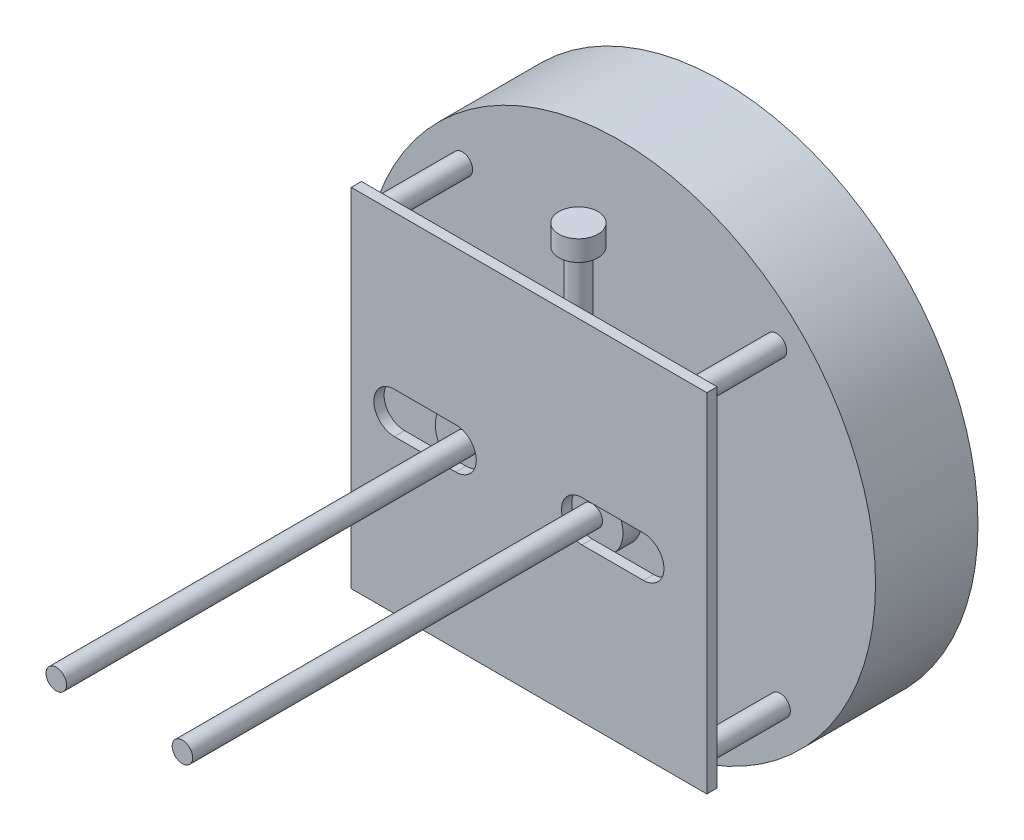
ISO-10303-21;
HEADER;
FILE_DESCRIPTION(('STEP AP214'),'2;1');
FILE_NAME('part.step','',(''),(''),'','','');
FILE_SCHEMA(('AUTOMOTIVE_DESIGN { 1 0 10303 214 1 1 1 1 }'));
ENDSEC;
DATA;
#1=APPLICATION_CONTEXT('core data for automotive mechanical design processes');
#2=APPLICATION_PROTOCOL_DEFINITION('international standard','automotive_design',2000,#1);
#3=PRODUCT_CONTEXT('',#1,'mechanical');
#4=PRODUCT('Part','Part','',(#3));
#5=PRODUCT_RELATED_PRODUCT_CATEGORY('part','',(#4));
#6=PRODUCT_DEFINITION_FORMATION('','',#4);
#7=PRODUCT_DEFINITION_CONTEXT('part definition',#1,'design');
#8=PRODUCT_DEFINITION('design','',#6,#7);
#9=PRODUCT_DEFINITION_SHAPE('','',#8);
#10=(LENGTH_UNIT() NAMED_UNIT(*) SI_UNIT(.MILLI.,.METRE.));
#11=(NAMED_UNIT(*) PLANE_ANGLE_UNIT() SI_UNIT($,.RADIAN.));
#12=(NAMED_UNIT(*) SI_UNIT($,.STERADIAN.) SOLID_ANGLE_UNIT());
#13=UNCERTAINTY_MEASURE_WITH_UNIT(LENGTH_MEASURE(1.E-05),#10,'distance_accuracy_value','');
#14=(GEOMETRIC_REPRESENTATION_CONTEXT(3) GLOBAL_UNCERTAINTY_ASSIGNED_CONTEXT((#13)) GLOBAL_UNIT_ASSIGNED_CONTEXT((#10,
#11,#12)) REPRESENTATION_CONTEXT('',''));
#15=CARTESIAN_POINT('',(0.,0.,0.));
#16=DIRECTION('',(0.,0.,1.));
#17=DIRECTION('',(1.,0.,0.));
#18=AXIS2_PLACEMENT_3D('',#15,#16,#17);
#19=CARTESIAN_POINT('',(0.,-30.,70.));
#20=DIRECTION('',(0.,-1.,0.));
#21=DIRECTION('',(1.,0.,0.));
#22=AXIS2_PLACEMENT_3D('',#19,#20,#21);
#23=CYLINDRICAL_SURFACE('',#22,5.);
#24=CARTESIAN_POINT('',(0.,-30.,70.));
#25=DIRECTION('',(0.,0.707106781186547,-0.707106781186547));
#26=DIRECTION('',(0.,-0.707106781186547,-0.707106781186547));
#27=AXIS2_PLACEMENT_3D('',#24,#25,#26);
#28=ELLIPSE('',#27,7.07106781186548,5.);
#29=CARTESIAN_POINT('',(5.,-30.,70.));
#30=VERTEX_POINT('',#29);
#31=CARTESIAN_POINT('',(-5.,-30.,70.));
#32=VERTEX_POINT('',#31);
#33=EDGE_CURVE('E193',#30,#32,#28,.T.);
#34=ORIENTED_EDGE('',*,*,#33,.F.);
#35=CARTESIAN_POINT('',(0.,-30.,70.));
#36=DIRECTION('',(0.,-1.,0.));
#37=DIRECTION('',(1.,0.,0.));
#38=AXIS2_PLACEMENT_3D('',#35,#36,#37);
#39=CIRCLE('',#38,5.);
#40=EDGE_CURVE('E69',#30,#32,#39,.T.);
#41=ORIENTED_EDGE('',*,*,#40,.T.);
#42=EDGE_LOOP('',(#34,#41));
#43=FACE_BOUND('',#42,.T.);
#44=CARTESIAN_POINT('',(0.,-90.,70.));
#45=DIRECTION('',(0.,-1.,0.));
#46=DIRECTION('',(1.,0.,0.));
#47=AXIS2_PLACEMENT_3D('',#44,#45,#46);
#48=CIRCLE('',#47,5.);
#49=CARTESIAN_POINT('',(5.00000000000001,-90.,70.));
#50=VERTEX_POINT('',#49);
#51=EDGE_CURVE('E57',#50,#50,#48,.F.);
#52=ORIENTED_EDGE('',*,*,#51,.T.);
#53=EDGE_LOOP('',(#52));
#54=FACE_BOUND('',#53,.T.);
#55=ADVANCED_FACE('F53',(#43,#54),#23,.T.);
#56=CARTESIAN_POINT('',(0.,30.,70.));
#57=DIRECTION('',(0.,1.,0.));
#58=DIRECTION('',(0.,0.,1.));
#59=AXIS2_PLACEMENT_3D('',#56,#57,#58);
#60=CYLINDRICAL_SURFACE('',#59,5.);
#61=CARTESIAN_POINT('',(0.,30.,70.));
#62=DIRECTION('',(0.,0.707106781186547,-0.707106781186547));
#63=DIRECTION('',(0.,-0.707106781186547,-0.707106781186547));
#64=AXIS2_PLACEMENT_3D('',#61,#62,#63);
#65=ELLIPSE('',#64,7.07106781186547,5.);
#66=CARTESIAN_POINT('',(5.,30.,70.));
#67=VERTEX_POINT('',#66);
#68=CARTESIAN_POINT('',(0.,25.,65.));
#69=VERTEX_POINT('',#68);
#70=EDGE_CURVE('E181',#67,#69,#65,.T.);
#71=ORIENTED_EDGE('',*,*,#70,.F.);
#72=CARTESIAN_POINT('',(0.,30.,70.));
#73=DIRECTION('',(0.,-0.707106781186547,-0.707106781186547));
#74=DIRECTION('',(0.,0.707106781186547,-0.707106781186547));
#75=AXIS2_PLACEMENT_3D('',#72,#73,#74);
#76=ELLIPSE('',#75,7.07106781186547,5.);
#77=CARTESIAN_POINT('',(-5.,30.,70.));
#78=VERTEX_POINT('',#77);
#79=EDGE_CURVE('E179',#78,#67,#76,.T.);
#80=ORIENTED_EDGE('',*,*,#79,.F.);
#81=EDGE_CURVE('E172',#69,#78,#65,.T.);
#82=ORIENTED_EDGE('',*,*,#81,.F.);
#83=CARTESIAN_POINT('',(0.,25.,70.));
#84=DIRECTION('',(0.,-1.,0.));
#85=DIRECTION('',(0.,0.,-1.));
#86=AXIS2_PLACEMENT_3D('',#83,#84,#85);
#87=CIRCLE('',#86,5.);
#88=EDGE_CURVE('E176',#69,#69,#87,.T.);
#89=ORIENTED_EDGE('',*,*,#88,.F.);
#90=EDGE_LOOP('',(#71,#80,#82,#89));
#91=FACE_BOUND('',#90,.T.);
#92=CARTESIAN_POINT('',(0.,90.,70.));
#93=DIRECTION('',(0.,1.,0.));
#94=DIRECTION('',(0.,0.,1.));
#95=AXIS2_PLACEMENT_3D('',#92,#93,#94);
#96=CIRCLE('',#95,5.);
#97=CARTESIAN_POINT('',(0.,90.,75.));
#98=VERTEX_POINT('',#97);
#99=EDGE_CURVE('E185',#98,#98,#96,.F.);
#100=ORIENTED_EDGE('',*,*,#99,.T.);
#101=EDGE_LOOP('',(#100));
#102=FACE_BOUND('',#101,.T.);
#103=ADVANCED_FACE('F174',(#91,#102),#60,.T.);
#104=CARTESIAN_POINT('',(0.,-30.,70.));
#105=DIRECTION('',(0.,0.,1.));
#106=DIRECTION('',(1.,0.,0.));
#107=AXIS2_PLACEMENT_3D('',#104,#105,#106);
#108=PLANE('',#107);
#109=CARTESIAN_POINT('',(0.,-30.,70.));
#110=DIRECTION('',(0.,0.,1.));
#111=DIRECTION('',(1.,0.,0.));
#112=AXIS2_PLACEMENT_3D('',#109,#110,#111);
#113=CIRCLE('',#112,5.);
#114=EDGE_CURVE('E198',#30,#32,#113,.T.);
#115=ORIENTED_EDGE('',*,*,#114,.T.);
#116=DIRECTION('',(1.,0.,0.));
#117=VECTOR('',#116,1.);
#118=CARTESIAN_POINT('',(0.,-30.,70.));
#119=LINE('',#118,#117);
#120=EDGE_CURVE('E12',#32,#30,#119,.T.);
#121=ORIENTED_EDGE('',*,*,#120,.T.);
#122=EDGE_LOOP('',(#115,#121));
#123=FACE_BOUND('',#122,.T.);
#124=ADVANCED_FACE('F408',(#123),#108,.T.);
#125=CARTESIAN_POINT('',(0.,0.,50.));
#126=DIRECTION('',(0.,0.,-1.));
#127=DIRECTION('',(-1.,0.,0.));
#128=AXIS2_PLACEMENT_3D('',#125,#126,#127);
#129=CYLINDRICAL_SURFACE('',#128,125.);
#130=CARTESIAN_POINT('',(0.,0.,50.));
#131=DIRECTION('',(0.,0.,1.));
#132=DIRECTION('',(1.,0.,0.));
#133=AXIS2_PLACEMENT_3D('',#130,#131,#132);
#134=CIRCLE('',#133,125.);
#135=CARTESIAN_POINT('',(125.,0.,50.));
#136=VERTEX_POINT('',#135);
#137=EDGE_CURVE('E322',#136,#136,#134,.T.);
#138=ORIENTED_EDGE('',*,*,#137,.F.);
#139=EDGE_LOOP('',(#138));
#140=FACE_BOUND('',#139,.T.);
#141=CARTESIAN_POINT('',(0.,0.,0.));
#142=DIRECTION('',(0.,0.,1.));
#143=DIRECTION('',(1.,0.,0.));
#144=AXIS2_PLACEMENT_3D('',#141,#142,#143);
#145=CIRCLE('',#144,125.);
#146=CARTESIAN_POINT('',(125.,0.,0.));
#147=VERTEX_POINT('',#146);
#148=EDGE_CURVE('E319',#147,#147,#145,.T.);
#149=ORIENTED_EDGE('',*,*,#148,.T.);
#150=EDGE_LOOP('',(#149));
#151=FACE_BOUND('',#150,.T.);
#152=ADVANCED_FACE('F55',(#140,#151),#129,.T.);
#153=CARTESIAN_POINT('',(0.,0.,50.));
#154=DIRECTION('',(0.,0.,1.));
#155=DIRECTION('',(1.,0.,0.));
#156=AXIS2_PLACEMENT_3D('',#153,#154,#155);
#157=PLANE('',#156);
#158=CARTESIAN_POINT('',(0.,-30.,50.));
#159=DIRECTION('',(0.,0.,1.));
#160=DIRECTION('',(1.,0.,0.));
#161=AXIS2_PLACEMENT_3D('',#158,#159,#160);
#162=CIRCLE('',#161,5.);
#163=CARTESIAN_POINT('',(5.,-30.,50.));
#164=VERTEX_POINT('',#163);
#165=EDGE_CURVE('E197',#164,#164,#162,.T.);
#166=ORIENTED_EDGE('',*,*,#165,.F.);
#167=EDGE_LOOP('',(#166));
#168=FACE_BOUND('',#167,.T.);
#169=CARTESIAN_POINT('',(0.,30.,50.));
#170=DIRECTION('',(0.,0.,1.));
#171=DIRECTION('',(1.,0.,0.));
#172=AXIS2_PLACEMENT_3D('',#169,#170,#171);
#173=CIRCLE('',#172,5.);
#174=CARTESIAN_POINT('',(5.,30.,50.));
#175=VERTEX_POINT('',#174);
#176=EDGE_CURVE('E201',#175,#175,#173,.T.);
#177=ORIENTED_EDGE('',*,*,#176,.F.);
#178=EDGE_LOOP('',(#177));
#179=FACE_BOUND('',#178,.T.);
#180=CARTESIAN_POINT('',(-76.6421356237309,-76.642135623731,50.));
#181=DIRECTION('',(0.,0.,1.));
#182=DIRECTION('',(1.,0.,0.));
#183=AXIS2_PLACEMENT_3D('',#180,#181,#182);
#184=CIRCLE('',#183,5.00000000000001);
#185=CARTESIAN_POINT('',(-71.6421356237309,-76.642135623731,50.));
#186=VERTEX_POINT('',#185);
#187=EDGE_CURVE('E297',#186,#186,#184,.T.);
#188=ORIENTED_EDGE('',*,*,#187,.F.);
#189=EDGE_LOOP('',(#188));
#190=FACE_BOUND('',#189,.T.);
#191=CARTESIAN_POINT('',(78.4136911559998,-74.6142244403616,50.));
#192=DIRECTION('',(0.,0.,1.));
#193=DIRECTION('',(1.,0.,0.));
#194=AXIS2_PLACEMENT_3D('',#191,#192,#193);
#195=CIRCLE('',#194,5.00000000000001);
#196=CARTESIAN_POINT('',(83.4136911559998,-74.6142244403616,50.));
#197=VERTEX_POINT('',#196);
#198=EDGE_CURVE('E301',#197,#197,#195,.T.);
#199=ORIENTED_EDGE('',*,*,#198,.F.);
#200=EDGE_LOOP('',(#199));
#201=FACE_BOUND('',#200,.T.);
#202=CARTESIAN_POINT('',(76.642135623731,76.642135623731,50.));
#203=DIRECTION('',(0.,0.,1.));
#204=DIRECTION('',(1.,0.,0.));
#205=AXIS2_PLACEMENT_3D('',#202,#203,#204);
#206=CIRCLE('',#205,5.00000000000001);
#207=CARTESIAN_POINT('',(81.642135623731,76.642135623731,50.));
#208=VERTEX_POINT('',#207);
#209=EDGE_CURVE('E307',#208,#208,#206,.T.);
#210=ORIENTED_EDGE('',*,*,#209,.F.);
#211=EDGE_LOOP('',(#210));
#212=FACE_BOUND('',#211,.T.);
#213=CARTESIAN_POINT('',(-76.642135623731,76.6421356237309,50.));
#214=DIRECTION('',(0.,0.,1.));
#215=DIRECTION('',(1.,0.,0.));
#216=AXIS2_PLACEMENT_3D('',#213,#214,#215);
#217=CIRCLE('',#216,5.00000000000001);
#218=CARTESIAN_POINT('',(-71.642135623731,76.6421356237309,50.));
#219=VERTEX_POINT('',#218);
#220=EDGE_CURVE('E313',#219,#219,#217,.T.);
#221=ORIENTED_EDGE('',*,*,#220,.F.);
#222=EDGE_LOOP('',(#221));
#223=FACE_BOUND('',#222,.T.);
#224=ORIENTED_EDGE('',*,*,#137,.T.);
#225=EDGE_LOOP('',(#224));
#226=FACE_BOUND('',#225,.T.);
#227=ADVANCED_FACE('F639',(#168,#179,#190,#201,#212,#223,#226),#157,.T.);
#228=CARTESIAN_POINT('',(0.,0.,0.));
#229=DIRECTION('',(0.,0.,1.));
#230=DIRECTION('',(1.,0.,0.));
#231=AXIS2_PLACEMENT_3D('',#228,#229,#230);
#232=PLANE('',#231);
#233=ORIENTED_EDGE('',*,*,#148,.F.);
#234=EDGE_LOOP('',(#233));
#235=FACE_BOUND('',#234,.T.);
#236=ADVANCED_FACE('F646',(#235),#232,.F.);
#237=CARTESIAN_POINT('',(-76.642135623731,76.6421356237309,90.));
#238=DIRECTION('',(0.,0.,-1.));
#239=DIRECTION('',(-1.,0.,0.));
#240=AXIS2_PLACEMENT_3D('',#237,#238,#239);
#241=CYLINDRICAL_SURFACE('',#240,5.00000000000001);
#242=CARTESIAN_POINT('',(-76.642135623731,76.6421356237309,90.));
#243=DIRECTION('',(0.,0.,1.));
#244=DIRECTION('',(1.,0.,0.));
#245=AXIS2_PLACEMENT_3D('',#242,#243,#244);
#246=CIRCLE('',#245,5.00000000000001);
#247=CARTESIAN_POINT('',(-71.642135623731,76.6421356237309,90.));
#248=VERTEX_POINT('',#247);
#249=EDGE_CURVE('E316',#248,#248,#246,.T.);
#250=ORIENTED_EDGE('',*,*,#249,.F.);
#251=EDGE_LOOP('',(#250));
#252=FACE_BOUND('',#251,.T.);
#253=ORIENTED_EDGE('',*,*,#220,.T.);
#254=EDGE_LOOP('',(#253));
#255=FACE_BOUND('',#254,.T.);
#256=ADVANCED_FACE('F653',(#252,#255),#241,.T.);
#257=CARTESIAN_POINT('',(76.642135623731,76.642135623731,90.));
#258=DIRECTION('',(0.,0.,-1.));
#259=DIRECTION('',(-1.,0.,0.));
#260=AXIS2_PLACEMENT_3D('',#257,#258,#259);
#261=CYLINDRICAL_SURFACE('',#260,5.00000000000001);
#262=CARTESIAN_POINT('',(76.642135623731,76.642135623731,90.));
#263=DIRECTION('',(0.,0.,1.));
#264=DIRECTION('',(1.,0.,0.));
#265=AXIS2_PLACEMENT_3D('',#262,#263,#264);
#266=CIRCLE('',#265,5.00000000000001);
#267=CARTESIAN_POINT('',(81.642135623731,76.642135623731,90.));
#268=VERTEX_POINT('',#267);
#269=EDGE_CURVE('E310',#268,#268,#266,.T.);
#270=ORIENTED_EDGE('',*,*,#269,.F.);
#271=EDGE_LOOP('',(#270));
#272=FACE_BOUND('',#271,.T.);
#273=ORIENTED_EDGE('',*,*,#209,.T.);
#274=EDGE_LOOP('',(#273));
#275=FACE_BOUND('',#274,.T.);
#276=ADVANCED_FACE('F660',(#272,#275),#261,.T.);
#277=CARTESIAN_POINT('',(78.4136911559998,-74.6142244403616,90.));
#278=DIRECTION('',(0.,0.,-1.));
#279=DIRECTION('',(-1.,0.,0.));
#280=AXIS2_PLACEMENT_3D('',#277,#278,#279);
#281=CYLINDRICAL_SURFACE('',#280,5.00000000000001);
#282=CARTESIAN_POINT('',(78.4136911559998,-74.6142244403616,90.));
#283=DIRECTION('',(0.,0.,1.));
#284=DIRECTION('',(1.,0.,0.));
#285=AXIS2_PLACEMENT_3D('',#282,#283,#284);
#286=CIRCLE('',#285,5.00000000000001);
#287=CARTESIAN_POINT('',(83.4136911559998,-74.6142244403616,90.));
#288=VERTEX_POINT('',#287);
#289=EDGE_CURVE('E304',#288,#288,#286,.T.);
#290=ORIENTED_EDGE('',*,*,#289,.F.);
#291=EDGE_LOOP('',(#290));
#292=FACE_BOUND('',#291,.T.);
#293=ORIENTED_EDGE('',*,*,#198,.T.);
#294=EDGE_LOOP('',(#293));
#295=FACE_BOUND('',#294,.T.);
#296=ADVANCED_FACE('F668',(#292,#295),#281,.T.);
#297=CARTESIAN_POINT('',(-76.6421356237309,-76.642135623731,90.));
#298=DIRECTION('',(0.,0.,-1.));
#299=DIRECTION('',(-1.,0.,0.));
#300=AXIS2_PLACEMENT_3D('',#297,#298,#299);
#301=CYLINDRICAL_SURFACE('',#300,5.00000000000001);
#302=CARTESIAN_POINT('',(-76.6421356237309,-76.642135623731,90.));
#303=DIRECTION('',(0.,0.,1.));
#304=DIRECTION('',(1.,0.,0.));
#305=AXIS2_PLACEMENT_3D('',#302,#303,#304);
#306=CIRCLE('',#305,5.00000000000001);
#307=CARTESIAN_POINT('',(-71.6421356237309,-76.642135623731,90.));
#308=VERTEX_POINT('',#307);
#309=EDGE_CURVE('E298',#308,#308,#306,.T.);
#310=ORIENTED_EDGE('',*,*,#309,.F.);
#311=EDGE_LOOP('',(#310));
#312=FACE_BOUND('',#311,.T.);
#313=ORIENTED_EDGE('',*,*,#187,.T.);
#314=EDGE_LOOP('',(#313));
#315=FACE_BOUND('',#314,.T.);
#316=ADVANCED_FACE('F676',(#312,#315),#301,.T.);
#317=CARTESIAN_POINT('',(-85.8829322655471,84.5606318369034,95.));
#318=DIRECTION('',(1.,0.,0.));
#319=DIRECTION('',(0.,0.,-1.));
#320=AXIS2_PLACEMENT_3D('',#317,#318,#319);
#321=PLANE('',#320);
#322=DIRECTION('',(0.,-1.,0.));
#323=VECTOR('',#322,1.);
#324=CARTESIAN_POINT('',(-85.8829322655471,84.5606318369034,90.));
#325=LINE('',#324,#323);
#326=CARTESIAN_POINT('',(-85.8829322655471,84.5606318369034,90.));
#327=VERTEX_POINT('',#326);
#328=CARTESIAN_POINT('',(-85.8829322655471,-85.0670684054218,90.));
#329=VERTEX_POINT('',#328);
#330=EDGE_CURVE('E261',#327,#329,#325,.T.);
#331=ORIENTED_EDGE('',*,*,#330,.T.);
#332=DIRECTION('',(0.,0.,-1.));
#333=VECTOR('',#332,1.);
#334=CARTESIAN_POINT('',(-85.8829322655471,-85.0670684054218,95.));
#335=LINE('',#334,#333);
#336=CARTESIAN_POINT('',(-85.8829322655471,-85.0670684054218,95.));
#337=VERTEX_POINT('',#336);
#338=EDGE_CURVE('E294',#337,#329,#335,.T.);
#339=ORIENTED_EDGE('',*,*,#338,.F.);
#340=DIRECTION('',(0.,-1.,0.));
#341=VECTOR('',#340,1.);
#342=CARTESIAN_POINT('',(-85.8829322655471,84.5606318369034,95.));
#343=LINE('',#342,#341);
#344=CARTESIAN_POINT('',(-85.8829322655471,84.5606318369034,95.));
#345=VERTEX_POINT('',#344);
#346=EDGE_CURVE('E268',#345,#337,#343,.T.);
#347=ORIENTED_EDGE('',*,*,#346,.F.);
#348=DIRECTION('',(0.,0.,-1.));
#349=VECTOR('',#348,1.);
#350=CARTESIAN_POINT('',(-85.8829322655471,84.5606318369034,95.));
#351=LINE('',#350,#349);
#352=EDGE_CURVE('E278',#345,#327,#351,.T.);
#353=ORIENTED_EDGE('',*,*,#352,.T.);
#354=EDGE_LOOP('',(#331,#339,#347,#353));
#355=FACE_BOUND('',#354,.T.);
#356=ADVANCED_FACE('F684',(#355),#321,.F.);
#357=CARTESIAN_POINT('',(-85.8829322655471,-85.0670684054218,95.));
#358=DIRECTION('',(0.,1.,0.));
#359=DIRECTION('',(0.,0.,1.));
#360=AXIS2_PLACEMENT_3D('',#357,#358,#359);
#361=PLANE('',#360);
#362=DIRECTION('',(1.,0.,0.));
#363=VECTOR('',#362,1.);
#364=CARTESIAN_POINT('',(-85.8829322655471,-85.0670684054218,90.));
#365=LINE('',#364,#363);
#366=CARTESIAN_POINT('',(87.6647358395211,-85.0670684054218,90.));
#367=VERTEX_POINT('',#366);
#368=EDGE_CURVE('E281',#329,#367,#365,.T.);
#369=ORIENTED_EDGE('',*,*,#368,.T.);
#370=DIRECTION('',(0.,0.,-1.));
#371=VECTOR('',#370,1.);
#372=CARTESIAN_POINT('',(87.6647358395211,-85.0670684054218,95.));
#373=LINE('',#372,#371);
#374=CARTESIAN_POINT('',(87.6647358395211,-85.0670684054218,95.));
#375=VERTEX_POINT('',#374);
#376=EDGE_CURVE('E291',#375,#367,#373,.T.);
#377=ORIENTED_EDGE('',*,*,#376,.F.);
#378=DIRECTION('',(1.,0.,0.));
#379=VECTOR('',#378,1.);
#380=CARTESIAN_POINT('',(-85.8829322655471,-85.0670684054218,95.));
#381=LINE('',#380,#379);
#382=EDGE_CURVE('E271',#337,#375,#381,.T.);
#383=ORIENTED_EDGE('',*,*,#382,.F.);
#384=ORIENTED_EDGE('',*,*,#338,.T.);
#385=EDGE_LOOP('',(#369,#377,#383,#384));
#386=FACE_BOUND('',#385,.T.);
#387=ADVANCED_FACE('F692',(#386),#361,.F.);
#388=CARTESIAN_POINT('',(87.664735839521,84.5606318369034,95.));
#389=DIRECTION('',(-1.,0.,0.));
#390=DIRECTION('',(0.,-1.,0.));
#391=AXIS2_PLACEMENT_3D('',#388,#389,#390);
#392=PLANE('',#391);
#393=DIRECTION('',(0.,1.,0.));
#394=VECTOR('',#393,1.);
#395=CARTESIAN_POINT('',(87.664735839521,84.5606318369034,90.));
#396=LINE('',#395,#394);
#397=CARTESIAN_POINT('',(87.664735839521,84.5606318369034,90.));
#398=VERTEX_POINT('',#397);
#399=EDGE_CURVE('E283',#367,#398,#396,.T.);
#400=ORIENTED_EDGE('',*,*,#399,.T.);
#401=DIRECTION('',(0.,0.,-1.));
#402=VECTOR('',#401,1.);
#403=CARTESIAN_POINT('',(87.664735839521,84.5606318369034,95.));
#404=LINE('',#403,#402);
#405=CARTESIAN_POINT('',(87.664735839521,84.5606318369034,95.));
#406=VERTEX_POINT('',#405);
#407=EDGE_CURVE('E288',#406,#398,#404,.T.);
#408=ORIENTED_EDGE('',*,*,#407,.F.);
#409=DIRECTION('',(0.,1.,0.));
#410=VECTOR('',#409,1.);
#411=CARTESIAN_POINT('',(87.664735839521,84.5606318369034,95.));
#412=LINE('',#411,#410);
#413=EDGE_CURVE('E274',#375,#406,#412,.T.);
#414=ORIENTED_EDGE('',*,*,#413,.F.);
#415=ORIENTED_EDGE('',*,*,#376,.T.);
#416=EDGE_LOOP('',(#400,#408,#414,#415));
#417=FACE_BOUND('',#416,.T.);
#418=ADVANCED_FACE('F700',(#417),#392,.F.);
#419=CARTESIAN_POINT('',(-85.8829322655471,84.5606318369034,95.));
#420=DIRECTION('',(0.,-1.,0.));
#421=DIRECTION('',(0.,0.,-1.));
#422=AXIS2_PLACEMENT_3D('',#419,#420,#421);
#423=PLANE('',#422);
#424=DIRECTION('',(-1.,0.,0.));
#425=VECTOR('',#424,1.);
#426=CARTESIAN_POINT('',(-85.8829322655471,84.5606318369034,90.));
#427=LINE('',#426,#425);
#428=EDGE_CURVE('E272',#398,#327,#427,.T.);
#429=ORIENTED_EDGE('',*,*,#428,.T.);
#430=ORIENTED_EDGE('',*,*,#352,.F.);
#431=DIRECTION('',(-1.,0.,0.));
#432=VECTOR('',#431,1.);
#433=CARTESIAN_POINT('',(-85.8829322655471,84.5606318369034,95.));
#434=LINE('',#433,#432);
#435=EDGE_CURVE('E276',#406,#345,#434,.T.);
#436=ORIENTED_EDGE('',*,*,#435,.F.);
#437=ORIENTED_EDGE('',*,*,#407,.T.);
#438=EDGE_LOOP('',(#429,#430,#436,#437));
#439=FACE_BOUND('',#438,.T.);
#440=ADVANCED_FACE('F708',(#439),#423,.F.);
#441=CARTESIAN_POINT('',(0.,0.,95.));
#442=DIRECTION('',(0.,0.,1.));
#443=DIRECTION('',(1.,0.,0.));
#444=AXIS2_PLACEMENT_3D('',#441,#442,#443);
#445=PLANE('',#444);
#446=CARTESIAN_POINT('',(26.7270536096101,-0.253218284259194,95.));
#447=DIRECTION('',(0.,0.,1.));
#448=DIRECTION('',(1.,0.,0.));
#449=AXIS2_PLACEMENT_3D('',#446,#447,#448);
#450=CIRCLE('',#449,10.);
#451=CARTESIAN_POINT('',(26.7270536096101,9.74678171574081,95.));
#452=VERTEX_POINT('',#451);
#453=CARTESIAN_POINT('',(26.7270536096101,-10.2532182842592,95.));
#454=VERTEX_POINT('',#453);
#455=EDGE_CURVE('E227',#452,#454,#450,.T.);
#456=ORIENTED_EDGE('',*,*,#455,.F.);
#457=DIRECTION('',(-1.,0.,0.));
#458=VECTOR('',#457,1.);
#459=CARTESIAN_POINT('',(26.7270536096101,9.74678171574081,95.));
#460=LINE('',#459,#458);
#461=CARTESIAN_POINT('',(56.7270536096101,9.74678171574081,95.));
#462=VERTEX_POINT('',#461);
#463=EDGE_CURVE('E235',#462,#452,#460,.T.);
#464=ORIENTED_EDGE('',*,*,#463,.F.);
#465=CARTESIAN_POINT('',(56.7270536096101,-0.253218284259192,95.));
#466=DIRECTION('',(0.,0.,1.));
#467=DIRECTION('',(1.,0.,0.));
#468=AXIS2_PLACEMENT_3D('',#465,#466,#467);
#469=CIRCLE('',#468,10.);
#470=CARTESIAN_POINT('',(56.7270536096101,-10.2532182842592,95.));
#471=VERTEX_POINT('',#470);
#472=EDGE_CURVE('E232',#471,#462,#469,.T.);
#473=ORIENTED_EDGE('',*,*,#472,.F.);
#474=DIRECTION('',(1.,0.,0.));
#475=VECTOR('',#474,1.);
#476=CARTESIAN_POINT('',(26.7270536096101,-10.2532182842592,95.));
#477=LINE('',#476,#475);
#478=EDGE_CURVE('E229',#454,#471,#477,.T.);
#479=ORIENTED_EDGE('',*,*,#478,.F.);
#480=EDGE_LOOP('',(#456,#464,#473,#479));
#481=FACE_BOUND('',#480,.T.);
#482=CARTESIAN_POINT('',(-64.8576500926538,-0.253218284259187,95.));
#483=DIRECTION('',(0.,0.,1.));
#484=DIRECTION('',(1.,0.,0.));
#485=AXIS2_PLACEMENT_3D('',#482,#483,#484);
#486=CIRCLE('',#485,10.);
#487=CARTESIAN_POINT('',(-64.8576500926538,9.74678171574081,95.));
#488=VERTEX_POINT('',#487);
#489=CARTESIAN_POINT('',(-64.8576500926538,-10.2532182842592,95.));
#490=VERTEX_POINT('',#489);
#491=EDGE_CURVE('E241',#488,#490,#486,.T.);
#492=ORIENTED_EDGE('',*,*,#491,.F.);
#493=DIRECTION('',(-1.,0.,0.));
#494=VECTOR('',#493,1.);
#495=CARTESIAN_POINT('',(-64.8576500926538,9.74678171574081,95.));
#496=LINE('',#495,#494);
#497=CARTESIAN_POINT('',(-34.8576500926538,9.74678171574081,95.));
#498=VERTEX_POINT('',#497);
#499=EDGE_CURVE('E255',#498,#488,#496,.T.);
#500=ORIENTED_EDGE('',*,*,#499,.F.);
#501=CARTESIAN_POINT('',(-34.8576500926538,-0.253218284259192,95.));
#502=DIRECTION('',(0.,0.,1.));
#503=DIRECTION('',(1.,0.,0.));
#504=AXIS2_PLACEMENT_3D('',#501,#502,#503);
#505=CIRCLE('',#504,10.);
#506=CARTESIAN_POINT('',(-34.8576500926538,-10.2532182842592,95.));
#507=VERTEX_POINT('',#506);
#508=EDGE_CURVE('E252',#507,#498,#505,.T.);
#509=ORIENTED_EDGE('',*,*,#508,.F.);
#510=DIRECTION('',(1.,0.,0.));
#511=VECTOR('',#510,1.);
#512=CARTESIAN_POINT('',(-64.8576500926538,-10.2532182842592,95.));
#513=LINE('',#512,#511);
#514=EDGE_CURVE('E249',#490,#507,#513,.T.);
#515=ORIENTED_EDGE('',*,*,#514,.F.);
#516=EDGE_LOOP('',(#492,#500,#509,#515));
#517=FACE_BOUND('',#516,.T.);
#518=ORIENTED_EDGE('',*,*,#346,.T.);
#519=ORIENTED_EDGE('',*,*,#382,.T.);
#520=ORIENTED_EDGE('',*,*,#413,.T.);
#521=ORIENTED_EDGE('',*,*,#435,.T.);
#522=EDGE_LOOP('',(#518,#519,#520,#521));
#523=FACE_BOUND('',#522,.T.);
#524=ADVANCED_FACE('F382',(#481,#517,#523),#445,.T.);
#525=CARTESIAN_POINT('',(0.,0.,90.));
#526=DIRECTION('',(0.,0.,1.));
#527=DIRECTION('',(1.,0.,0.));
#528=AXIS2_PLACEMENT_3D('',#525,#526,#527);
#529=PLANE('',#528);
#530=CARTESIAN_POINT('',(-34.8576500926538,-0.253218284259192,90.));
#531=DIRECTION('',(0.,0.,-1.));
#532=DIRECTION('',(-1.,0.,0.));
#533=AXIS2_PLACEMENT_3D('',#530,#531,#532);
#534=CIRCLE('',#533,15.);
#535=CARTESIAN_POINT('',(-46.0379899801527,9.74678171574081,90.));
#536=VERTEX_POINT('',#535);
#537=CARTESIAN_POINT('',(-46.0379899801527,-10.2532182842592,90.));
#538=VERTEX_POINT('',#537);
#539=EDGE_CURVE('E77',#536,#538,#534,.T.);
#540=ORIENTED_EDGE('',*,*,#539,.F.);
#541=DIRECTION('',(-1.,0.,0.));
#542=VECTOR('',#541,1.);
#543=CARTESIAN_POINT('',(0.,9.74678171574081,90.));
#544=LINE('',#543,#542);
#545=CARTESIAN_POINT('',(-64.8576500926538,9.74678171574081,90.));
#546=VERTEX_POINT('',#545);
#547=EDGE_CURVE('E333',#536,#546,#544,.T.);
#548=ORIENTED_EDGE('',*,*,#547,.T.);
#549=CARTESIAN_POINT('',(-64.8576500926538,-0.253218284259187,90.));
#550=DIRECTION('',(0.,0.,1.));
#551=DIRECTION('',(1.,0.,0.));
#552=AXIS2_PLACEMENT_3D('',#549,#550,#551);
#553=CIRCLE('',#552,10.);
#554=CARTESIAN_POINT('',(-64.8576500926538,-10.2532182842592,90.));
#555=VERTEX_POINT('',#554);
#556=EDGE_CURVE('E337',#546,#555,#553,.T.);
#557=ORIENTED_EDGE('',*,*,#556,.T.);
#558=DIRECTION('',(1.,0.,0.));
#559=VECTOR('',#558,1.);
#560=CARTESIAN_POINT('',(0.,-10.2532182842592,90.));
#561=LINE('',#560,#559);
#562=EDGE_CURVE('E328',#555,#538,#561,.T.);
#563=ORIENTED_EDGE('',*,*,#562,.T.);
#564=EDGE_LOOP('',(#540,#548,#557,#563));
#565=FACE_BOUND('',#564,.T.);
#566=CARTESIAN_POINT('',(26.7270536096101,-0.253218284259194,90.));
#567=DIRECTION('',(0.,0.,-1.));
#568=DIRECTION('',(-1.,0.,0.));
#569=AXIS2_PLACEMENT_3D('',#566,#567,#568);
#570=CIRCLE('',#569,15.);
#571=CARTESIAN_POINT('',(37.907393497109,-10.2532182842592,90.));
#572=VERTEX_POINT('',#571);
#573=CARTESIAN_POINT('',(37.907393497109,9.74678171574081,90.));
#574=VERTEX_POINT('',#573);
#575=EDGE_CURVE('E216',#572,#574,#570,.T.);
#576=ORIENTED_EDGE('',*,*,#575,.F.);
#577=DIRECTION('',(1.,0.,0.));
#578=VECTOR('',#577,1.);
#579=CARTESIAN_POINT('',(0.,-10.2532182842592,90.));
#580=LINE('',#579,#578);
#581=CARTESIAN_POINT('',(56.7270536096101,-10.2532182842592,90.));
#582=VERTEX_POINT('',#581);
#583=EDGE_CURVE('E340',#572,#582,#580,.T.);
#584=ORIENTED_EDGE('',*,*,#583,.T.);
#585=CARTESIAN_POINT('',(56.7270536096101,-0.253218284259192,90.));
#586=DIRECTION('',(0.,0.,1.));
#587=DIRECTION('',(1.,0.,0.));
#588=AXIS2_PLACEMENT_3D('',#585,#586,#587);
#589=CIRCLE('',#588,10.);
#590=CARTESIAN_POINT('',(56.7270536096101,9.74678171574081,90.));
#591=VERTEX_POINT('',#590);
#592=EDGE_CURVE('E344',#582,#591,#589,.T.);
#593=ORIENTED_EDGE('',*,*,#592,.T.);
#594=DIRECTION('',(-1.,0.,0.));
#595=VECTOR('',#594,1.);
#596=CARTESIAN_POINT('',(0.,9.74678171574081,90.));
#597=LINE('',#596,#595);
#598=EDGE_CURVE('E347',#591,#574,#597,.T.);
#599=ORIENTED_EDGE('',*,*,#598,.T.);
#600=EDGE_LOOP('',(#576,#584,#593,#599));
#601=FACE_BOUND('',#600,.T.);
#602=ORIENTED_EDGE('',*,*,#249,.T.);
#603=EDGE_LOOP('',(#602));
#604=FACE_BOUND('',#603,.T.);
#605=ORIENTED_EDGE('',*,*,#269,.T.);
#606=EDGE_LOOP('',(#605));
#607=FACE_BOUND('',#606,.T.);
#608=ORIENTED_EDGE('',*,*,#289,.T.);
#609=EDGE_LOOP('',(#608));
#610=FACE_BOUND('',#609,.T.);
#611=ORIENTED_EDGE('',*,*,#309,.T.);
#612=EDGE_LOOP('',(#611));
#613=FACE_BOUND('',#612,.T.);
#614=ORIENTED_EDGE('',*,*,#330,.F.);
#615=ORIENTED_EDGE('',*,*,#428,.F.);
#616=ORIENTED_EDGE('',*,*,#399,.F.);
#617=ORIENTED_EDGE('',*,*,#368,.F.);
#618=EDGE_LOOP('',(#614,#615,#616,#617));
#619=FACE_BOUND('',#618,.T.);
#620=ADVANCED_FACE('F388',(#565,#601,#604,#607,#610,#613,#619),#529,.F.);
#621=CARTESIAN_POINT('',(-64.8576500926538,-0.253218284259187,76.));
#622=DIRECTION('',(0.,0.,1.));
#623=DIRECTION('',(1.,0.,0.));
#624=AXIS2_PLACEMENT_3D('',#621,#622,#623);
#625=CYLINDRICAL_SURFACE('',#624,10.);
#626=DIRECTION('',(0.,0.,1.));
#627=VECTOR('',#626,1.);
#628=CARTESIAN_POINT('',(-64.8576500926538,9.74678171574081,76.));
#629=LINE('',#628,#627);
#630=EDGE_CURVE('E259',#546,#488,#629,.T.);
#631=ORIENTED_EDGE('',*,*,#630,.T.);
#632=ORIENTED_EDGE('',*,*,#491,.T.);
#633=DIRECTION('',(0.,0.,1.));
#634=VECTOR('',#633,1.);
#635=CARTESIAN_POINT('',(-64.8576500926538,-10.2532182842592,76.));
#636=LINE('',#635,#634);
#637=EDGE_CURVE('E258',#555,#490,#636,.T.);
#638=ORIENTED_EDGE('',*,*,#637,.F.);
#639=ORIENTED_EDGE('',*,*,#556,.F.);
#640=EDGE_LOOP('',(#631,#632,#638,#639));
#641=FACE_BOUND('',#640,.T.);
#642=ADVANCED_FACE('F391',(#641),#625,.F.);
#643=CARTESIAN_POINT('',(-64.8576500926538,9.74678171574081,76.));
#644=DIRECTION('',(0.,1.,0.));
#645=DIRECTION('',(-1.,0.,0.));
#646=AXIS2_PLACEMENT_3D('',#643,#644,#645);
#647=PLANE('',#646);
#648=DIRECTION('',(0.,0.,1.));
#649=VECTOR('',#648,1.);
#650=CARTESIAN_POINT('',(-34.8576500926538,9.74678171574081,76.));
#651=LINE('',#650,#649);
#652=CARTESIAN_POINT('',(-34.8576500926538,9.74678171574081,90.));
#653=VERTEX_POINT('',#652);
#654=EDGE_CURVE('E262',#653,#498,#651,.T.);
#655=ORIENTED_EDGE('',*,*,#654,.T.);
#656=ORIENTED_EDGE('',*,*,#499,.T.);
#657=ORIENTED_EDGE('',*,*,#630,.F.);
#658=ORIENTED_EDGE('',*,*,#547,.F.);
#659=EDGE_CURVE('E334',#653,#536,#544,.T.);
#660=ORIENTED_EDGE('',*,*,#659,.F.);
#661=EDGE_LOOP('',(#655,#656,#657,#658,#660));
#662=FACE_BOUND('',#661,.T.);
#663=ADVANCED_FACE('F386',(#662),#647,.F.);
#664=CARTESIAN_POINT('',(-34.8576500926538,-0.253218284259192,76.));
#665=DIRECTION('',(0.,0.,1.));
#666=DIRECTION('',(1.,0.,0.));
#667=AXIS2_PLACEMENT_3D('',#664,#665,#666);
#668=CYLINDRICAL_SURFACE('',#667,10.);
#669=DIRECTION('',(0.,0.,1.));
#670=VECTOR('',#669,1.);
#671=CARTESIAN_POINT('',(-34.8576500926538,-10.2532182842592,76.));
#672=LINE('',#671,#670);
#673=CARTESIAN_POINT('',(-34.8576500926538,-10.2532182842592,90.));
#674=VERTEX_POINT('',#673);
#675=EDGE_CURVE('E264',#674,#507,#672,.T.);
#676=ORIENTED_EDGE('',*,*,#675,.T.);
#677=ORIENTED_EDGE('',*,*,#508,.T.);
#678=ORIENTED_EDGE('',*,*,#654,.F.);
#679=CARTESIAN_POINT('',(-34.8576500926538,-0.253218284259192,90.));
#680=DIRECTION('',(0.,0.,1.));
#681=DIRECTION('',(1.,0.,0.));
#682=AXIS2_PLACEMENT_3D('',#679,#680,#681);
#683=CIRCLE('',#682,10.);
#684=EDGE_CURVE('E330',#674,#653,#683,.T.);
#685=ORIENTED_EDGE('',*,*,#684,.F.);
#686=EDGE_LOOP('',(#676,#677,#678,#685));
#687=FACE_BOUND('',#686,.T.);
#688=ADVANCED_FACE('F373',(#687),#668,.F.);
#689=CARTESIAN_POINT('',(-64.8576500926538,-10.2532182842592,76.));
#690=DIRECTION('',(0.,-1.,0.));
#691=DIRECTION('',(1.,0.,0.));
#692=AXIS2_PLACEMENT_3D('',#689,#690,#691);
#693=PLANE('',#692);
#694=ORIENTED_EDGE('',*,*,#637,.T.);
#695=ORIENTED_EDGE('',*,*,#514,.T.);
#696=ORIENTED_EDGE('',*,*,#675,.F.);
#697=EDGE_CURVE('E325',#538,#674,#561,.T.);
#698=ORIENTED_EDGE('',*,*,#697,.F.);
#699=ORIENTED_EDGE('',*,*,#562,.F.);
#700=EDGE_LOOP('',(#694,#695,#696,#698,#699));
#701=FACE_BOUND('',#700,.T.);
#702=ADVANCED_FACE('F375',(#701),#693,.F.);
#703=CARTESIAN_POINT('',(26.7270536096101,-0.253218284259194,76.));
#704=DIRECTION('',(0.,0.,1.));
#705=DIRECTION('',(1.,0.,0.));
#706=AXIS2_PLACEMENT_3D('',#703,#704,#705);
#707=CYLINDRICAL_SURFACE('',#706,10.);
#708=DIRECTION('',(0.,0.,1.));
#709=VECTOR('',#708,1.);
#710=CARTESIAN_POINT('',(26.7270536096101,9.74678171574081,76.));
#711=LINE('',#710,#709);
#712=CARTESIAN_POINT('',(26.7270536096101,9.74678171574081,90.));
#713=VERTEX_POINT('',#712);
#714=EDGE_CURVE('E239',#713,#452,#711,.T.);
#715=ORIENTED_EDGE('',*,*,#714,.T.);
#716=ORIENTED_EDGE('',*,*,#455,.T.);
#717=DIRECTION('',(0.,0.,1.));
#718=VECTOR('',#717,1.);
#719=CARTESIAN_POINT('',(26.7270536096101,-10.2532182842592,76.));
#720=LINE('',#719,#718);
#721=CARTESIAN_POINT('',(26.7270536096101,-10.2532182842592,90.));
#722=VERTEX_POINT('',#721);
#723=EDGE_CURVE('E238',#722,#454,#720,.T.);
#724=ORIENTED_EDGE('',*,*,#723,.F.);
#725=CARTESIAN_POINT('',(26.7270536096101,-0.253218284259194,90.));
#726=DIRECTION('',(0.,0.,1.));
#727=DIRECTION('',(1.,0.,0.));
#728=AXIS2_PLACEMENT_3D('',#725,#726,#727);
#729=CIRCLE('',#728,10.);
#730=EDGE_CURVE('E350',#713,#722,#729,.T.);
#731=ORIENTED_EDGE('',*,*,#730,.F.);
#732=EDGE_LOOP('',(#715,#716,#724,#731));
#733=FACE_BOUND('',#732,.T.);
#734=ADVANCED_FACE('F465',(#733),#707,.F.);
#735=CARTESIAN_POINT('',(26.7270536096101,9.74678171574081,76.));
#736=DIRECTION('',(0.,1.,0.));
#737=DIRECTION('',(0.,0.,1.));
#738=AXIS2_PLACEMENT_3D('',#735,#736,#737);
#739=PLANE('',#738);
#740=DIRECTION('',(0.,0.,1.));
#741=VECTOR('',#740,1.);
#742=CARTESIAN_POINT('',(56.7270536096101,9.74678171574081,76.));
#743=LINE('',#742,#741);
#744=EDGE_CURVE('E242',#591,#462,#743,.T.);
#745=ORIENTED_EDGE('',*,*,#744,.T.);
#746=ORIENTED_EDGE('',*,*,#463,.T.);
#747=ORIENTED_EDGE('',*,*,#714,.F.);
#748=DIRECTION('',(-1.,0.,0.));
#749=VECTOR('',#748,1.);
#750=CARTESIAN_POINT('',(26.7270536096101,9.74678171574081,90.));
#751=LINE('',#750,#749);
#752=EDGE_CURVE('E221',#574,#713,#751,.T.);
#753=ORIENTED_EDGE('',*,*,#752,.F.);
#754=ORIENTED_EDGE('',*,*,#598,.F.);
#755=EDGE_LOOP('',(#745,#746,#747,#753,#754));
#756=FACE_BOUND('',#755,.T.);
#757=ADVANCED_FACE('F461',(#756),#739,.F.);
#758=CARTESIAN_POINT('',(56.7270536096101,-0.253218284259192,76.));
#759=DIRECTION('',(0.,0.,1.));
#760=DIRECTION('',(1.,0.,0.));
#761=AXIS2_PLACEMENT_3D('',#758,#759,#760);
#762=CYLINDRICAL_SURFACE('',#761,10.);
#763=DIRECTION('',(0.,0.,1.));
#764=VECTOR('',#763,1.);
#765=CARTESIAN_POINT('',(56.7270536096101,-10.2532182842592,76.));
#766=LINE('',#765,#764);
#767=EDGE_CURVE('E244',#582,#471,#766,.T.);
#768=ORIENTED_EDGE('',*,*,#767,.T.);
#769=ORIENTED_EDGE('',*,*,#472,.T.);
#770=ORIENTED_EDGE('',*,*,#744,.F.);
#771=ORIENTED_EDGE('',*,*,#592,.F.);
#772=EDGE_LOOP('',(#768,#769,#770,#771));
#773=FACE_BOUND('',#772,.T.);
#774=ADVANCED_FACE('F464',(#773),#762,.F.);
#775=CARTESIAN_POINT('',(26.7270536096101,-10.2532182842592,76.));
#776=DIRECTION('',(0.,-1.,0.));
#777=DIRECTION('',(0.,0.,-1.));
#778=AXIS2_PLACEMENT_3D('',#775,#776,#777);
#779=PLANE('',#778);
#780=ORIENTED_EDGE('',*,*,#723,.T.);
#781=ORIENTED_EDGE('',*,*,#478,.T.);
#782=ORIENTED_EDGE('',*,*,#767,.F.);
#783=ORIENTED_EDGE('',*,*,#583,.F.);
#784=EDGE_CURVE('E341',#722,#572,#580,.T.);
#785=ORIENTED_EDGE('',*,*,#784,.F.);
#786=EDGE_LOOP('',(#780,#781,#782,#783,#785));
#787=FACE_BOUND('',#786,.T.);
#788=ADVANCED_FACE('F456',(#787),#779,.F.);
#789=CARTESIAN_POINT('',(26.7270536096101,-0.253218284259194,90.));
#790=DIRECTION('',(0.,0.,-1.));
#791=DIRECTION('',(-1.,0.,0.));
#792=AXIS2_PLACEMENT_3D('',#789,#790,#791);
#793=PLANE('',#792);
#794=CARTESIAN_POINT('',(26.7270536096101,-0.253218284259194,90.));
#795=DIRECTION('',(0.,0.,-1.));
#796=DIRECTION('',(-1.,0.,0.));
#797=AXIS2_PLACEMENT_3D('',#794,#795,#796);
#798=CIRCLE('',#797,5.);
#799=CARTESIAN_POINT('',(21.7270536096101,-0.253218284259194,90.));
#800=VERTEX_POINT('',#799);
#801=EDGE_CURVE('E353',#800,#800,#798,.F.);
#802=ORIENTED_EDGE('',*,*,#801,.F.);
#803=EDGE_LOOP('',(#802));
#804=FACE_BOUND('',#803,.T.);
#805=EDGE_CURVE('E222',#574,#572,#570,.T.);
#806=ORIENTED_EDGE('',*,*,#805,.F.);
#807=ORIENTED_EDGE('',*,*,#752,.T.);
#808=ORIENTED_EDGE('',*,*,#730,.T.);
#809=ORIENTED_EDGE('',*,*,#784,.T.);
#810=EDGE_LOOP('',(#806,#807,#808,#809));
#811=FACE_BOUND('',#810,.T.);
#812=ADVANCED_FACE('F453',(#804,#811),#793,.F.);
#813=CARTESIAN_POINT('',(26.7270536096101,-0.253218284259194,81.));
#814=DIRECTION('',(0.,0.,1.));
#815=DIRECTION('',(1.,0.,0.));
#816=AXIS2_PLACEMENT_3D('',#813,#814,#815);
#817=CYLINDRICAL_SURFACE('',#816,15.);
#818=CARTESIAN_POINT('',(26.7270536096101,-0.253218284259194,81.));
#819=DIRECTION('',(0.,0.,-1.));
#820=DIRECTION('',(-1.,0.,0.));
#821=AXIS2_PLACEMENT_3D('',#818,#819,#820);
#822=CIRCLE('',#821,15.);
#823=CARTESIAN_POINT('',(11.7270536096101,-0.253218284259194,81.));
#824=VERTEX_POINT('',#823);
#825=EDGE_CURVE('E218',#824,#824,#822,.T.);
#826=ORIENTED_EDGE('',*,*,#825,.F.);
#827=EDGE_LOOP('',(#826));
#828=FACE_BOUND('',#827,.T.);
#829=ORIENTED_EDGE('',*,*,#805,.T.);
#830=ORIENTED_EDGE('',*,*,#575,.T.);
#831=EDGE_LOOP('',(#829,#830));
#832=FACE_BOUND('',#831,.T.);
#833=ADVANCED_FACE('F451',(#828,#832),#817,.T.);
#834=CARTESIAN_POINT('',(26.7270536096101,-0.253218284259194,81.));
#835=DIRECTION('',(0.,0.,-1.));
#836=DIRECTION('',(-1.,0.,0.));
#837=AXIS2_PLACEMENT_3D('',#834,#835,#836);
#838=PLANE('',#837);
#839=ORIENTED_EDGE('',*,*,#825,.T.);
#840=EDGE_LOOP('',(#839));
#841=FACE_BOUND('',#840,.T.);
#842=ADVANCED_FACE('F365',(#841),#838,.T.);
#843=CARTESIAN_POINT('',(-34.8576500926538,-0.253218284259192,90.));
#844=DIRECTION('',(0.,0.,-1.));
#845=DIRECTION('',(-1.,0.,0.));
#846=AXIS2_PLACEMENT_3D('',#843,#844,#845);
#847=PLANE('',#846);
#848=CARTESIAN_POINT('',(-34.8576500926538,-0.253218284259192,90.));
#849=DIRECTION('',(0.,0.,-1.));
#850=DIRECTION('',(-1.,0.,0.));
#851=AXIS2_PLACEMENT_3D('',#848,#849,#850);
#852=CIRCLE('',#851,5.);
#853=CARTESIAN_POINT('',(-39.8576500926538,-0.253218284259192,90.));
#854=VERTEX_POINT('',#853);
#855=EDGE_CURVE('E62',#854,#854,#852,.F.);
#856=ORIENTED_EDGE('',*,*,#855,.F.);
#857=EDGE_LOOP('',(#856));
#858=FACE_BOUND('',#857,.T.);
#859=ORIENTED_EDGE('',*,*,#684,.T.);
#860=ORIENTED_EDGE('',*,*,#659,.T.);
#861=EDGE_CURVE('E212',#538,#536,#534,.T.);
#862=ORIENTED_EDGE('',*,*,#861,.F.);
#863=ORIENTED_EDGE('',*,*,#697,.T.);
#864=EDGE_LOOP('',(#859,#860,#862,#863));
#865=FACE_BOUND('',#864,.T.);
#866=ADVANCED_FACE('F361',(#858,#865),#847,.F.);
#867=CARTESIAN_POINT('',(-34.8576500926538,-0.253218284259192,81.));
#868=DIRECTION('',(0.,0.,1.));
#869=DIRECTION('',(1.,0.,0.));
#870=AXIS2_PLACEMENT_3D('',#867,#868,#869);
#871=CYLINDRICAL_SURFACE('',#870,15.);
#872=CARTESIAN_POINT('',(-34.8576500926538,-0.253218284259192,81.));
#873=DIRECTION('',(0.,0.,-1.));
#874=DIRECTION('',(-1.,0.,0.));
#875=AXIS2_PLACEMENT_3D('',#872,#873,#874);
#876=CIRCLE('',#875,15.);
#877=CARTESIAN_POINT('',(-49.8576500926538,-0.253218284259192,81.));
#878=VERTEX_POINT('',#877);
#879=EDGE_CURVE('E213',#878,#878,#876,.T.);
#880=ORIENTED_EDGE('',*,*,#879,.F.);
#881=EDGE_LOOP('',(#880));
#882=FACE_BOUND('',#881,.T.);
#883=ORIENTED_EDGE('',*,*,#539,.T.);
#884=ORIENTED_EDGE('',*,*,#861,.T.);
#885=EDGE_LOOP('',(#883,#884));
#886=FACE_BOUND('',#885,.T.);
#887=ADVANCED_FACE('F364',(#882,#886),#871,.T.);
#888=CARTESIAN_POINT('',(-34.8576500926538,-0.253218284259192,81.));
#889=DIRECTION('',(0.,0.,-1.));
#890=DIRECTION('',(-1.,0.,0.));
#891=AXIS2_PLACEMENT_3D('',#888,#889,#890);
#892=PLANE('',#891);
#893=ORIENTED_EDGE('',*,*,#879,.T.);
#894=EDGE_LOOP('',(#893));
#895=FACE_BOUND('',#894,.T.);
#896=ADVANCED_FACE('F441',(#895),#892,.T.);
#897=CARTESIAN_POINT('',(26.7270536096101,-0.253218284259194,290.));
#898=DIRECTION('',(0.,0.,-1.));
#899=DIRECTION('',(-1.,0.,0.));
#900=AXIS2_PLACEMENT_3D('',#897,#898,#899);
#901=CYLINDRICAL_SURFACE('',#900,5.);
#902=CARTESIAN_POINT('',(26.7270536096101,-0.253218284259194,290.));
#903=DIRECTION('',(0.,0.,1.));
#904=DIRECTION('',(1.,0.,0.));
#905=AXIS2_PLACEMENT_3D('',#902,#903,#904);
#906=CIRCLE('',#905,5.);
#907=CARTESIAN_POINT('',(31.7270536096101,-0.253218284259194,290.));
#908=VERTEX_POINT('',#907);
#909=EDGE_CURVE('E209',#908,#908,#906,.T.);
#910=ORIENTED_EDGE('',*,*,#909,.F.);
#911=EDGE_LOOP('',(#910));
#912=FACE_BOUND('',#911,.T.);
#913=ORIENTED_EDGE('',*,*,#801,.T.);
#914=EDGE_LOOP('',(#913));
#915=FACE_BOUND('',#914,.T.);
#916=ADVANCED_FACE('F437',(#912,#915),#901,.T.);
#917=CARTESIAN_POINT('',(26.7270536096101,-0.253218284259194,290.));
#918=DIRECTION('',(0.,0.,1.));
#919=DIRECTION('',(1.,0.,0.));
#920=AXIS2_PLACEMENT_3D('',#917,#918,#919);
#921=PLANE('',#920);
#922=ORIENTED_EDGE('',*,*,#909,.T.);
#923=EDGE_LOOP('',(#922));
#924=FACE_BOUND('',#923,.T.);
#925=ADVANCED_FACE('F433',(#924),#921,.T.);
#926=CARTESIAN_POINT('',(-34.8576500926538,-0.253218284259192,290.));
#927=DIRECTION('',(0.,0.,-1.));
#928=DIRECTION('',(-1.,0.,0.));
#929=AXIS2_PLACEMENT_3D('',#926,#927,#928);
#930=CYLINDRICAL_SURFACE('',#929,5.);
#931=CARTESIAN_POINT('',(-34.8576500926538,-0.253218284259192,290.));
#932=DIRECTION('',(0.,0.,1.));
#933=DIRECTION('',(1.,0.,0.));
#934=AXIS2_PLACEMENT_3D('',#931,#932,#933);
#935=CIRCLE('',#934,5.);
#936=CARTESIAN_POINT('',(-29.8576500926538,-0.253218284259192,290.));
#937=VERTEX_POINT('',#936);
#938=EDGE_CURVE('E206',#937,#937,#935,.T.);
#939=ORIENTED_EDGE('',*,*,#938,.F.);
#940=EDGE_LOOP('',(#939));
#941=FACE_BOUND('',#940,.T.);
#942=ORIENTED_EDGE('',*,*,#855,.T.);
#943=EDGE_LOOP('',(#942));
#944=FACE_BOUND('',#943,.T.);
#945=ADVANCED_FACE('F359',(#941,#944),#930,.T.);
#946=CARTESIAN_POINT('',(-34.8576500926538,-0.253218284259192,290.));
#947=DIRECTION('',(0.,0.,1.));
#948=DIRECTION('',(1.,0.,0.));
#949=AXIS2_PLACEMENT_3D('',#946,#947,#948);
#950=PLANE('',#949);
#951=ORIENTED_EDGE('',*,*,#938,.T.);
#952=EDGE_LOOP('',(#951));
#953=FACE_BOUND('',#952,.T.);
#954=ADVANCED_FACE('F427',(#953),#950,.T.);
#955=CARTESIAN_POINT('',(0.,30.,70.));
#956=DIRECTION('',(0.,0.,-1.));
#957=DIRECTION('',(-1.,0.,0.));
#958=AXIS2_PLACEMENT_3D('',#955,#956,#957);
#959=CYLINDRICAL_SURFACE('',#958,5.);
#960=ORIENTED_EDGE('',*,*,#79,.T.);
#961=ORIENTED_EDGE('',*,*,#70,.T.);
#962=ORIENTED_EDGE('',*,*,#81,.T.);
#963=EDGE_LOOP('',(#960,#961,#962));
#964=FACE_BOUND('',#963,.T.);
#965=ORIENTED_EDGE('',*,*,#176,.T.);
#966=EDGE_LOOP('',(#965));
#967=FACE_BOUND('',#966,.T.);
#968=ADVANCED_FACE('F423',(#964,#967),#959,.T.);
#969=CARTESIAN_POINT('',(0.,-30.,70.));
#970=DIRECTION('',(0.,0.,-1.));
#971=DIRECTION('',(-1.,0.,0.));
#972=AXIS2_PLACEMENT_3D('',#969,#970,#971);
#973=CYLINDRICAL_SURFACE('',#972,5.);
#974=ORIENTED_EDGE('',*,*,#114,.F.);
#975=ORIENTED_EDGE('',*,*,#33,.T.);
#976=EDGE_LOOP('',(#974,#975));
#977=FACE_BOUND('',#976,.T.);
#978=ORIENTED_EDGE('',*,*,#165,.T.);
#979=EDGE_LOOP('',(#978));
#980=FACE_BOUND('',#979,.T.);
#981=ADVANCED_FACE('F416',(#977,#980),#973,.T.);
#982=CARTESIAN_POINT('',(0.,-30.,70.));
#983=DIRECTION('',(0.,-1.,0.));
#984=DIRECTION('',(1.,0.,0.));
#985=AXIS2_PLACEMENT_3D('',#982,#983,#984);
#986=PLANE('',#985);
#987=ORIENTED_EDGE('',*,*,#120,.F.);
#988=ORIENTED_EDGE('',*,*,#40,.F.);
#989=EDGE_LOOP('',(#987,#988));
#990=FACE_BOUND('',#989,.T.);
#991=ADVANCED_FACE('F414',(#990),#986,.F.);
#992=CARTESIAN_POINT('',(0.,25.,70.));
#993=DIRECTION('',(0.,-1.,0.));
#994=DIRECTION('',(0.,0.,-1.));
#995=AXIS2_PLACEMENT_3D('',#992,#993,#994);
#996=PLANE('',#995);
#997=ORIENTED_EDGE('',*,*,#88,.T.);
#998=EDGE_LOOP('',(#997));
#999=FACE_BOUND('',#998,.T.);
#1000=ADVANCED_FACE('F184',(#999),#996,.T.);
#1001=CARTESIAN_POINT('',(0.,90.,70.));
#1002=DIRECTION('',(0.,1.,0.));
#1003=DIRECTION('',(0.,0.,1.));
#1004=AXIS2_PLACEMENT_3D('',#1001,#1002,#1003);
#1005=CYLINDRICAL_SURFACE('',#1004,9.54538990239939);
#1006=CARTESIAN_POINT('',(0.,90.,70.));
#1007=DIRECTION('',(0.,1.,0.));
#1008=DIRECTION('',(0.,0.,1.));
#1009=AXIS2_PLACEMENT_3D('',#1006,#1007,#1008);
#1010=CIRCLE('',#1009,9.54538990239939);
#1011=CARTESIAN_POINT('',(0.,90.,79.5453899023994));
#1012=VERTEX_POINT('',#1011);
#1013=EDGE_CURVE('E188',#1012,#1012,#1010,.T.);
#1014=ORIENTED_EDGE('',*,*,#1013,.T.);
#1015=EDGE_LOOP('',(#1014));
#1016=FACE_BOUND('',#1015,.T.);
#1017=CARTESIAN_POINT('',(0.,100.006,70.));
#1018=DIRECTION('',(0.,1.,0.));
#1019=DIRECTION('',(0.,0.,1.));
#1020=AXIS2_PLACEMENT_3D('',#1017,#1018,#1019);
#1021=CIRCLE('',#1020,9.54538990239939);
#1022=CARTESIAN_POINT('',(0.,100.006,79.5453899023994));
#1023=VERTEX_POINT('',#1022);
#1024=EDGE_CURVE('E870',#1023,#1023,#1021,.T.);
#1025=ORIENTED_EDGE('',*,*,#1024,.F.);
#1026=EDGE_LOOP('',(#1025));
#1027=FACE_BOUND('',#1026,.T.);
#1028=ADVANCED_FACE('F559',(#1016,#1027),#1005,.T.);
#1029=CARTESIAN_POINT('',(0.,90.,70.));
#1030=DIRECTION('',(0.,1.,0.));
#1031=DIRECTION('',(0.,0.,1.));
#1032=AXIS2_PLACEMENT_3D('',#1029,#1030,#1031);
#1033=PLANE('',#1032);
#1034=ORIENTED_EDGE('',*,*,#99,.F.);
#1035=EDGE_LOOP('',(#1034));
#1036=FACE_BOUND('',#1035,.T.);
#1037=ORIENTED_EDGE('',*,*,#1013,.F.);
#1038=EDGE_LOOP('',(#1037));
#1039=FACE_BOUND('',#1038,.T.);
#1040=ADVANCED_FACE('F566',(#1036,#1039),#1033,.F.);
#1041=CARTESIAN_POINT('',(0.,100.006,70.));
#1042=DIRECTION('',(0.,1.,0.));
#1043=DIRECTION('',(0.,0.,1.));
#1044=AXIS2_PLACEMENT_3D('',#1041,#1042,#1043);
#1045=PLANE('',#1044);
#1046=ORIENTED_EDGE('',*,*,#1024,.T.);
#1047=EDGE_LOOP('',(#1046));
#1048=FACE_BOUND('',#1047,.T.);
#1049=ADVANCED_FACE('F573',(#1048),#1045,.T.);
#1050=CARTESIAN_POINT('',(0.,-90.,70.));
#1051=DIRECTION('',(0.,-1.,0.));
#1052=DIRECTION('',(1.,0.,0.));
#1053=AXIS2_PLACEMENT_3D('',#1050,#1051,#1052);
#1054=CYLINDRICAL_SURFACE('',#1053,9.48720918520282);
#1055=CARTESIAN_POINT('',(0.,-90.,70.));
#1056=DIRECTION('',(0.,-1.,0.));
#1057=DIRECTION('',(1.,0.,0.));
#1058=AXIS2_PLACEMENT_3D('',#1055,#1056,#1057);
#1059=CIRCLE('',#1058,9.48720918520282);
#1060=CARTESIAN_POINT('',(9.48720918520283,-90.,70.));
#1061=VERTEX_POINT('',#1060);
#1062=EDGE_CURVE('E866',#1061,#1061,#1059,.T.);
#1063=ORIENTED_EDGE('',*,*,#1062,.T.);
#1064=EDGE_LOOP('',(#1063));
#1065=FACE_BOUND('',#1064,.T.);
#1066=CARTESIAN_POINT('',(0.,-100.006,70.));
#1067=DIRECTION('',(0.,-1.,0.));
#1068=DIRECTION('',(1.,0.,0.));
#1069=AXIS2_PLACEMENT_3D('',#1066,#1067,#1068);
#1070=CIRCLE('',#1069,9.48720918520282);
#1071=CARTESIAN_POINT('',(9.48720918520283,-100.006,70.));
#1072=VERTEX_POINT('',#1071);
#1073=EDGE_CURVE('E864',#1072,#1072,#1070,.T.);
#1074=ORIENTED_EDGE('',*,*,#1073,.F.);
#1075=EDGE_LOOP('',(#1074));
#1076=FACE_BOUND('',#1075,.T.);
#1077=ADVANCED_FACE('F581',(#1065,#1076),#1054,.T.);
#1078=CARTESIAN_POINT('',(0.,-90.,70.));
#1079=DIRECTION('',(0.,-1.,0.));
#1080=DIRECTION('',(1.,0.,0.));
#1081=AXIS2_PLACEMENT_3D('',#1078,#1079,#1080);
#1082=PLANE('',#1081);
#1083=ORIENTED_EDGE('',*,*,#51,.F.);
#1084=EDGE_LOOP('',(#1083));
#1085=FACE_BOUND('',#1084,.T.);
#1086=ORIENTED_EDGE('',*,*,#1062,.F.);
#1087=EDGE_LOOP('',(#1086));
#1088=FACE_BOUND('',#1087,.T.);
#1089=ADVANCED_FACE('F589',(#1085,#1088),#1082,.F.);
#1090=CARTESIAN_POINT('',(0.,-100.006,70.));
#1091=DIRECTION('',(0.,-1.,0.));
#1092=DIRECTION('',(1.,0.,0.));
#1093=AXIS2_PLACEMENT_3D('',#1090,#1091,#1092);
#1094=PLANE('',#1093);
#1095=ORIENTED_EDGE('',*,*,#1073,.T.);
#1096=EDGE_LOOP('',(#1095));
#1097=FACE_BOUND('',#1096,.T.);
#1098=ADVANCED_FACE('F597',(#1097),#1094,.T.);
#1099=CLOSED_SHELL('',(#55,#103,#124,#152,#227,#236,#256,#276,#296,#316,#356,#387,#418,#440,
#524,#620,#642,#663,#688,#702,#734,#757,#774,#788,#812,#833,#842,#866,#887,#896,#916,#925,#945,
#954,#968,#981,#991,#1000,#1028,#1040,#1049,#1077,#1089,#1098));
#1100=MANIFOLD_SOLID_BREP('B2',#1099);
#1101=ADVANCED_BREP_SHAPE_REPRESENTATION('',(#18,#1100),#14);
#1102=SHAPE_DEFINITION_REPRESENTATION(#9,#1101);
ENDSEC;
END-ISO-10303-21;
